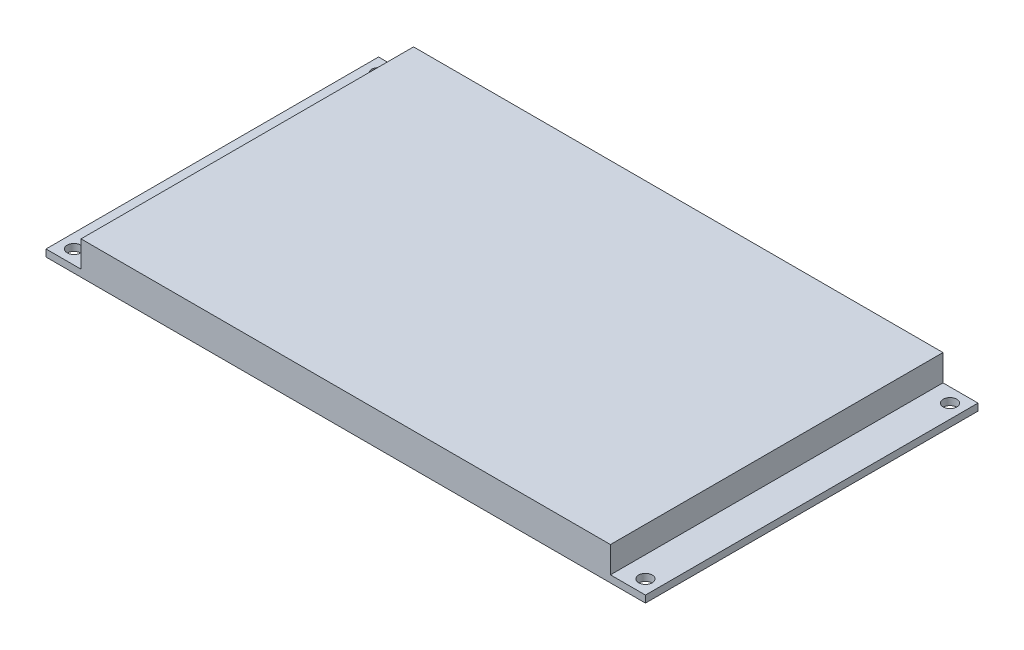
ISO-10303-21;
HEADER;
FILE_DESCRIPTION(('STEP AP214'),'2;1');
FILE_NAME('part.step','',(''),(''),'','','');
FILE_SCHEMA(('AUTOMOTIVE_DESIGN { 1 0 10303 214 1 1 1 1 }'));
ENDSEC;
DATA;
#1=APPLICATION_CONTEXT('core data for automotive mechanical design processes');
#2=APPLICATION_PROTOCOL_DEFINITION('international standard','automotive_design',2000,#1);
#3=PRODUCT_CONTEXT('',#1,'mechanical');
#4=PRODUCT('Part','Part','',(#3));
#5=PRODUCT_RELATED_PRODUCT_CATEGORY('part','',(#4));
#6=PRODUCT_DEFINITION_FORMATION('','',#4);
#7=PRODUCT_DEFINITION_CONTEXT('part definition',#1,'design');
#8=PRODUCT_DEFINITION('design','',#6,#7);
#9=PRODUCT_DEFINITION_SHAPE('','',#8);
#10=(LENGTH_UNIT() NAMED_UNIT(*) SI_UNIT(.MILLI.,.METRE.));
#11=(NAMED_UNIT(*) PLANE_ANGLE_UNIT() SI_UNIT($,.RADIAN.));
#12=(NAMED_UNIT(*) SI_UNIT($,.STERADIAN.) SOLID_ANGLE_UNIT());
#13=UNCERTAINTY_MEASURE_WITH_UNIT(LENGTH_MEASURE(1.E-05),#10,'distance_accuracy_value','');
#14=(GEOMETRIC_REPRESENTATION_CONTEXT(3) GLOBAL_UNCERTAINTY_ASSIGNED_CONTEXT((#13)) GLOBAL_UNIT_ASSIGNED_CONTEXT((#10,
#11,#12)) REPRESENTATION_CONTEXT('',''));
#15=CARTESIAN_POINT('',(0.,0.,0.));
#16=DIRECTION('',(0.,0.,1.));
#17=DIRECTION('',(1.,0.,0.));
#18=AXIS2_PLACEMENT_3D('',#15,#16,#17);
#19=CARTESIAN_POINT('',(0.,1.6,0.));
#20=DIRECTION('',(0.,1.,0.));
#21=DIRECTION('',(0.,0.,1.));
#22=AXIS2_PLACEMENT_3D('',#19,#20,#21);
#23=PLANE('',#22);
#24=CARTESIAN_POINT('',(3.20000000000001,1.6,72.8));
#25=DIRECTION('',(0.,1.,0.));
#26=DIRECTION('',(0.,0.,1.));
#27=AXIS2_PLACEMENT_3D('',#24,#25,#26);
#28=CIRCLE('',#27,1.54999999999999);
#29=CARTESIAN_POINT('',(3.20000000000001,1.6,74.35));
#30=VERTEX_POINT('',#29);
#31=EDGE_CURVE('E187',#30,#30,#28,.T.);
#32=ORIENTED_EDGE('',*,*,#31,.F.);
#33=EDGE_LOOP('',(#32));
#34=FACE_BOUND('',#33,.T.);
#35=CARTESIAN_POINT('',(3.2,1.6,3.2));
#36=DIRECTION('',(0.,1.,0.));
#37=DIRECTION('',(0.,0.,1.));
#38=AXIS2_PLACEMENT_3D('',#35,#36,#37);
#39=CIRCLE('',#38,1.55);
#40=CARTESIAN_POINT('',(3.2,1.6,4.75));
#41=VERTEX_POINT('',#40);
#42=EDGE_CURVE('E162',#41,#41,#39,.T.);
#43=ORIENTED_EDGE('',*,*,#42,.F.);
#44=EDGE_LOOP('',(#43));
#45=FACE_BOUND('',#44,.T.);
#46=DIRECTION('',(0.,0.,1.));
#47=VECTOR('',#46,1.);
#48=CARTESIAN_POINT('',(8.00000000000001,1.6,0.));
#49=LINE('',#48,#47);
#50=CARTESIAN_POINT('',(8.00000000000001,1.6,0.));
#51=VERTEX_POINT('',#50);
#52=CARTESIAN_POINT('',(8.00000000000001,1.6,76.));
#53=VERTEX_POINT('',#52);
#54=EDGE_CURVE('E54',#51,#53,#49,.T.);
#55=ORIENTED_EDGE('',*,*,#54,.F.);
#56=DIRECTION('',(-1.,0.,0.));
#57=VECTOR('',#56,1.);
#58=CARTESIAN_POINT('',(0.,1.6,0.));
#59=LINE('',#58,#57);
#60=CARTESIAN_POINT('',(0.,1.6,0.));
#61=VERTEX_POINT('',#60);
#62=EDGE_CURVE('E143',#51,#61,#59,.T.);
#63=ORIENTED_EDGE('',*,*,#62,.T.);
#64=DIRECTION('',(0.,0.,1.));
#65=VECTOR('',#64,1.);
#66=CARTESIAN_POINT('',(0.,1.6,0.));
#67=LINE('',#66,#65);
#68=CARTESIAN_POINT('',(0.,1.6,76.));
#69=VERTEX_POINT('',#68);
#70=EDGE_CURVE('E134',#61,#69,#67,.T.);
#71=ORIENTED_EDGE('',*,*,#70,.T.);
#72=DIRECTION('',(1.,0.,0.));
#73=VECTOR('',#72,1.);
#74=CARTESIAN_POINT('',(0.,1.6,76.));
#75=LINE('',#74,#73);
#76=EDGE_CURVE('E139',#69,#53,#75,.T.);
#77=ORIENTED_EDGE('',*,*,#76,.T.);
#78=EDGE_LOOP('',(#55,#63,#71,#77));
#79=FACE_BOUND('',#78,.T.);
#80=ADVANCED_FACE('F37',(#34,#45,#79),#23,.T.);
#81=CARTESIAN_POINT('',(0.,1.6,0.));
#82=DIRECTION('',(1.,0.,0.));
#83=DIRECTION('',(0.,0.,-1.));
#84=AXIS2_PLACEMENT_3D('',#81,#82,#83);
#85=PLANE('',#84);
#86=DIRECTION('',(0.,0.,1.));
#87=VECTOR('',#86,1.);
#88=CARTESIAN_POINT('',(0.,0.,0.));
#89=LINE('',#88,#87);
#90=CARTESIAN_POINT('',(0.,0.,0.));
#91=VERTEX_POINT('',#90);
#92=CARTESIAN_POINT('',(0.,0.,76.));
#93=VERTEX_POINT('',#92);
#94=EDGE_CURVE('E125',#91,#93,#89,.T.);
#95=ORIENTED_EDGE('',*,*,#94,.T.);
#96=DIRECTION('',(0.,-1.,0.));
#97=VECTOR('',#96,1.);
#98=CARTESIAN_POINT('',(0.,1.6,76.));
#99=LINE('',#98,#97);
#100=EDGE_CURVE('E11',#69,#93,#99,.T.);
#101=ORIENTED_EDGE('',*,*,#100,.F.);
#102=ORIENTED_EDGE('',*,*,#70,.F.);
#103=DIRECTION('',(0.,-1.,0.));
#104=VECTOR('',#103,1.);
#105=CARTESIAN_POINT('',(0.,1.6,0.));
#106=LINE('',#105,#104);
#107=EDGE_CURVE('E145',#61,#91,#106,.T.);
#108=ORIENTED_EDGE('',*,*,#107,.T.);
#109=EDGE_LOOP('',(#95,#101,#102,#108));
#110=FACE_BOUND('',#109,.T.);
#111=ADVANCED_FACE('F39',(#110),#85,.F.);
#112=CARTESIAN_POINT('',(0.,1.6,76.));
#113=DIRECTION('',(0.,0.,-1.));
#114=DIRECTION('',(-1.,0.,0.));
#115=AXIS2_PLACEMENT_3D('',#112,#113,#114);
#116=PLANE('',#115);
#117=DIRECTION('',(1.,0.,0.));
#118=VECTOR('',#117,1.);
#119=CARTESIAN_POINT('',(0.,0.,76.));
#120=LINE('',#119,#118);
#121=CARTESIAN_POINT('',(137.,0.,76.));
#122=VERTEX_POINT('',#121);
#123=EDGE_CURVE('E128',#93,#122,#120,.T.);
#124=ORIENTED_EDGE('',*,*,#123,.T.);
#125=DIRECTION('',(0.,-1.,0.));
#126=VECTOR('',#125,1.);
#127=CARTESIAN_POINT('',(137.,1.6,76.));
#128=LINE('',#127,#126);
#129=CARTESIAN_POINT('',(137.,1.6,76.));
#130=VERTEX_POINT('',#129);
#131=EDGE_CURVE('E46',#130,#122,#128,.T.);
#132=ORIENTED_EDGE('',*,*,#131,.F.);
#133=CARTESIAN_POINT('',(129.,1.6,76.));
#134=VERTEX_POINT('',#133);
#135=EDGE_CURVE('E137',#134,#130,#75,.T.);
#136=ORIENTED_EDGE('',*,*,#135,.F.);
#137=DIRECTION('',(0.,-1.,0.));
#138=VECTOR('',#137,1.);
#139=CARTESIAN_POINT('',(129.,7.6,76.));
#140=LINE('',#139,#138);
#141=CARTESIAN_POINT('',(129.,7.6,76.));
#142=VERTEX_POINT('',#141);
#143=EDGE_CURVE('E110',#142,#134,#140,.T.);
#144=ORIENTED_EDGE('',*,*,#143,.F.);
#145=DIRECTION('',(1.,0.,0.));
#146=VECTOR('',#145,1.);
#147=CARTESIAN_POINT('',(8.00000000000001,7.6,76.));
#148=LINE('',#147,#146);
#149=CARTESIAN_POINT('',(8.00000000000001,7.6,76.));
#150=VERTEX_POINT('',#149);
#151=EDGE_CURVE('E104',#150,#142,#148,.T.);
#152=ORIENTED_EDGE('',*,*,#151,.F.);
#153=DIRECTION('',(0.,-1.,0.));
#154=VECTOR('',#153,1.);
#155=CARTESIAN_POINT('',(8.00000000000001,7.6,76.));
#156=LINE('',#155,#154);
#157=EDGE_CURVE('E108',#150,#53,#156,.T.);
#158=ORIENTED_EDGE('',*,*,#157,.T.);
#159=ORIENTED_EDGE('',*,*,#76,.F.);
#160=ORIENTED_EDGE('',*,*,#100,.T.);
#161=EDGE_LOOP('',(#124,#132,#136,#144,#152,#158,#159,#160));
#162=FACE_BOUND('',#161,.T.);
#163=ADVANCED_FACE('F106',(#162),#116,.F.);
#164=CARTESIAN_POINT('',(137.,1.6,0.));
#165=DIRECTION('',(-1.,0.,0.));
#166=DIRECTION('',(0.,0.,1.));
#167=AXIS2_PLACEMENT_3D('',#164,#165,#166);
#168=PLANE('',#167);
#169=DIRECTION('',(0.,0.,-1.));
#170=VECTOR('',#169,1.);
#171=CARTESIAN_POINT('',(137.,0.,0.));
#172=LINE('',#171,#170);
#173=CARTESIAN_POINT('',(137.,0.,0.));
#174=VERTEX_POINT('',#173);
#175=EDGE_CURVE('E148',#122,#174,#172,.T.);
#176=ORIENTED_EDGE('',*,*,#175,.T.);
#177=DIRECTION('',(0.,-1.,0.));
#178=VECTOR('',#177,1.);
#179=CARTESIAN_POINT('',(137.,1.6,0.));
#180=LINE('',#179,#178);
#181=CARTESIAN_POINT('',(137.,1.6,0.));
#182=VERTEX_POINT('',#181);
#183=EDGE_CURVE('E153',#182,#174,#180,.T.);
#184=ORIENTED_EDGE('',*,*,#183,.F.);
#185=DIRECTION('',(0.,0.,-1.));
#186=VECTOR('',#185,1.);
#187=CARTESIAN_POINT('',(137.,1.6,0.));
#188=LINE('',#187,#186);
#189=EDGE_CURVE('E141',#130,#182,#188,.T.);
#190=ORIENTED_EDGE('',*,*,#189,.F.);
#191=ORIENTED_EDGE('',*,*,#131,.T.);
#192=EDGE_LOOP('',(#176,#184,#190,#191));
#193=FACE_BOUND('',#192,.T.);
#194=ADVANCED_FACE('F211',(#193),#168,.F.);
#195=CARTESIAN_POINT('',(0.,1.6,0.));
#196=DIRECTION('',(0.,0.,1.));
#197=DIRECTION('',(1.,0.,0.));
#198=AXIS2_PLACEMENT_3D('',#195,#196,#197);
#199=PLANE('',#198);
#200=DIRECTION('',(-1.,0.,0.));
#201=VECTOR('',#200,1.);
#202=CARTESIAN_POINT('',(0.,0.,0.));
#203=LINE('',#202,#201);
#204=EDGE_CURVE('E138',#174,#91,#203,.T.);
#205=ORIENTED_EDGE('',*,*,#204,.T.);
#206=ORIENTED_EDGE('',*,*,#107,.F.);
#207=ORIENTED_EDGE('',*,*,#62,.F.);
#208=DIRECTION('',(0.,-1.,0.));
#209=VECTOR('',#208,1.);
#210=CARTESIAN_POINT('',(8.00000000000001,7.6,0.));
#211=LINE('',#210,#209);
#212=CARTESIAN_POINT('',(8.00000000000001,7.6,0.));
#213=VERTEX_POINT('',#212);
#214=EDGE_CURVE('E176',#213,#51,#211,.T.);
#215=ORIENTED_EDGE('',*,*,#214,.F.);
#216=DIRECTION('',(-1.,0.,0.));
#217=VECTOR('',#216,1.);
#218=CARTESIAN_POINT('',(8.00000000000001,7.6,0.));
#219=LINE('',#218,#217);
#220=CARTESIAN_POINT('',(129.,7.6,0.));
#221=VERTEX_POINT('',#220);
#222=EDGE_CURVE('E119',#221,#213,#219,.T.);
#223=ORIENTED_EDGE('',*,*,#222,.F.);
#224=DIRECTION('',(0.,-1.,0.));
#225=VECTOR('',#224,1.);
#226=CARTESIAN_POINT('',(129.,7.6,0.));
#227=LINE('',#226,#225);
#228=CARTESIAN_POINT('',(129.,1.6,0.));
#229=VERTEX_POINT('',#228);
#230=EDGE_CURVE('E130',#221,#229,#227,.T.);
#231=ORIENTED_EDGE('',*,*,#230,.T.);
#232=EDGE_CURVE('E144',#182,#229,#59,.T.);
#233=ORIENTED_EDGE('',*,*,#232,.F.);
#234=ORIENTED_EDGE('',*,*,#183,.T.);
#235=EDGE_LOOP('',(#205,#206,#207,#215,#223,#231,#233,#234));
#236=FACE_BOUND('',#235,.T.);
#237=ADVANCED_FACE('F181',(#236),#199,.F.);
#238=CARTESIAN_POINT('',(133.8,1.6,3.19999999999998));
#239=DIRECTION('',(0.,1.,0.));
#240=DIRECTION('',(0.,0.,1.));
#241=AXIS2_PLACEMENT_3D('',#238,#239,#240);
#242=CIRCLE('',#241,1.54999999999999);
#243=CARTESIAN_POINT('',(133.8,1.6,4.74999999999998));
#244=VERTEX_POINT('',#243);
#245=EDGE_CURVE('E188',#244,#244,#242,.T.);
#246=ORIENTED_EDGE('',*,*,#245,.F.);
#247=EDGE_LOOP('',(#246));
#248=FACE_BOUND('',#247,.T.);
#249=CARTESIAN_POINT('',(133.8,1.6,72.8));
#250=DIRECTION('',(0.,1.,0.));
#251=DIRECTION('',(0.,0.,1.));
#252=AXIS2_PLACEMENT_3D('',#249,#250,#251);
#253=CIRCLE('',#252,1.54999999999999);
#254=CARTESIAN_POINT('',(133.8,1.6,74.35));
#255=VERTEX_POINT('',#254);
#256=EDGE_CURVE('E191',#255,#255,#253,.T.);
#257=ORIENTED_EDGE('',*,*,#256,.F.);
#258=EDGE_LOOP('',(#257));
#259=FACE_BOUND('',#258,.T.);
#260=DIRECTION('',(0.,0.,-1.));
#261=VECTOR('',#260,1.);
#262=CARTESIAN_POINT('',(129.,1.6,0.));
#263=LINE('',#262,#261);
#264=EDGE_CURVE('E62',#134,#229,#263,.T.);
#265=ORIENTED_EDGE('',*,*,#264,.F.);
#266=ORIENTED_EDGE('',*,*,#135,.T.);
#267=ORIENTED_EDGE('',*,*,#189,.T.);
#268=ORIENTED_EDGE('',*,*,#232,.T.);
#269=EDGE_LOOP('',(#265,#266,#267,#268));
#270=FACE_BOUND('',#269,.T.);
#271=ADVANCED_FACE('F200',(#248,#259,#270),#23,.T.);
#272=CARTESIAN_POINT('',(0.,0.,0.));
#273=DIRECTION('',(0.,1.,0.));
#274=DIRECTION('',(0.,0.,1.));
#275=AXIS2_PLACEMENT_3D('',#272,#273,#274);
#276=PLANE('',#275);
#277=CARTESIAN_POINT('',(3.20000000000001,0.,72.8));
#278=DIRECTION('',(0.,1.,0.));
#279=DIRECTION('',(0.,0.,1.));
#280=AXIS2_PLACEMENT_3D('',#277,#278,#279);
#281=CIRCLE('',#280,1.54999999999999);
#282=CARTESIAN_POINT('',(3.20000000000001,0.,74.35));
#283=VERTEX_POINT('',#282);
#284=EDGE_CURVE('E41',#283,#283,#281,.T.);
#285=ORIENTED_EDGE('',*,*,#284,.T.);
#286=EDGE_LOOP('',(#285));
#287=FACE_BOUND('',#286,.T.);
#288=CARTESIAN_POINT('',(133.8,0.,3.19999999999998));
#289=DIRECTION('',(0.,1.,0.));
#290=DIRECTION('',(0.,0.,1.));
#291=AXIS2_PLACEMENT_3D('',#288,#289,#290);
#292=CIRCLE('',#291,1.54999999999999);
#293=CARTESIAN_POINT('',(133.8,0.,4.74999999999998));
#294=VERTEX_POINT('',#293);
#295=EDGE_CURVE('E164',#294,#294,#292,.T.);
#296=ORIENTED_EDGE('',*,*,#295,.T.);
#297=EDGE_LOOP('',(#296));
#298=FACE_BOUND('',#297,.T.);
#299=CARTESIAN_POINT('',(133.8,0.,72.8));
#300=DIRECTION('',(0.,1.,0.));
#301=DIRECTION('',(0.,0.,1.));
#302=AXIS2_PLACEMENT_3D('',#299,#300,#301);
#303=CIRCLE('',#302,1.54999999999999);
#304=CARTESIAN_POINT('',(133.8,0.,74.35));
#305=VERTEX_POINT('',#304);
#306=EDGE_CURVE('E161',#305,#305,#303,.T.);
#307=ORIENTED_EDGE('',*,*,#306,.T.);
#308=EDGE_LOOP('',(#307));
#309=FACE_BOUND('',#308,.T.);
#310=CARTESIAN_POINT('',(3.2,0.,3.2));
#311=DIRECTION('',(0.,1.,0.));
#312=DIRECTION('',(0.,0.,1.));
#313=AXIS2_PLACEMENT_3D('',#310,#311,#312);
#314=CIRCLE('',#313,1.55);
#315=CARTESIAN_POINT('',(3.2,0.,4.75));
#316=VERTEX_POINT('',#315);
#317=EDGE_CURVE('E158',#316,#316,#314,.T.);
#318=ORIENTED_EDGE('',*,*,#317,.T.);
#319=EDGE_LOOP('',(#318));
#320=FACE_BOUND('',#319,.T.);
#321=ORIENTED_EDGE('',*,*,#94,.F.);
#322=ORIENTED_EDGE('',*,*,#204,.F.);
#323=ORIENTED_EDGE('',*,*,#175,.F.);
#324=ORIENTED_EDGE('',*,*,#123,.F.);
#325=EDGE_LOOP('',(#321,#322,#323,#324));
#326=FACE_BOUND('',#325,.T.);
#327=ADVANCED_FACE('F202',(#287,#298,#309,#320,#326),#276,.F.);
#328=CARTESIAN_POINT('',(8.00000000000001,7.6,0.));
#329=DIRECTION('',(1.,0.,0.));
#330=DIRECTION('',(0.,0.,-1.));
#331=AXIS2_PLACEMENT_3D('',#328,#329,#330);
#332=PLANE('',#331);
#333=ORIENTED_EDGE('',*,*,#54,.T.);
#334=ORIENTED_EDGE('',*,*,#157,.F.);
#335=DIRECTION('',(0.,0.,1.));
#336=VECTOR('',#335,1.);
#337=CARTESIAN_POINT('',(8.00000000000001,7.6,0.));
#338=LINE('',#337,#336);
#339=EDGE_CURVE('E114',#213,#150,#338,.T.);
#340=ORIENTED_EDGE('',*,*,#339,.F.);
#341=ORIENTED_EDGE('',*,*,#214,.T.);
#342=EDGE_LOOP('',(#333,#334,#340,#341));
#343=FACE_BOUND('',#342,.T.);
#344=ADVANCED_FACE('F124',(#343),#332,.F.);
#345=CARTESIAN_POINT('',(129.,7.6,0.));
#346=DIRECTION('',(-1.,0.,0.));
#347=DIRECTION('',(0.,0.,1.));
#348=AXIS2_PLACEMENT_3D('',#345,#346,#347);
#349=PLANE('',#348);
#350=ORIENTED_EDGE('',*,*,#264,.T.);
#351=ORIENTED_EDGE('',*,*,#230,.F.);
#352=DIRECTION('',(0.,0.,-1.));
#353=VECTOR('',#352,1.);
#354=CARTESIAN_POINT('',(129.,7.6,0.));
#355=LINE('',#354,#353);
#356=EDGE_CURVE('E113',#142,#221,#355,.T.);
#357=ORIENTED_EDGE('',*,*,#356,.F.);
#358=ORIENTED_EDGE('',*,*,#143,.T.);
#359=EDGE_LOOP('',(#350,#351,#357,#358));
#360=FACE_BOUND('',#359,.T.);
#361=ADVANCED_FACE('F183',(#360),#349,.F.);
#362=CARTESIAN_POINT('',(0.,7.6,0.));
#363=DIRECTION('',(0.,1.,0.));
#364=DIRECTION('',(0.,0.,1.));
#365=AXIS2_PLACEMENT_3D('',#362,#363,#364);
#366=PLANE('',#365);
#367=ORIENTED_EDGE('',*,*,#339,.T.);
#368=ORIENTED_EDGE('',*,*,#151,.T.);
#369=ORIENTED_EDGE('',*,*,#356,.T.);
#370=ORIENTED_EDGE('',*,*,#222,.T.);
#371=EDGE_LOOP('',(#367,#368,#369,#370));
#372=FACE_BOUND('',#371,.T.);
#373=ADVANCED_FACE('F117',(#372),#366,.T.);
#374=CARTESIAN_POINT('',(3.2,-4.,3.2));
#375=DIRECTION('',(0.,1.,0.));
#376=DIRECTION('',(0.,0.,1.));
#377=AXIS2_PLACEMENT_3D('',#374,#375,#376);
#378=CYLINDRICAL_SURFACE('',#377,1.55);
#379=ORIENTED_EDGE('',*,*,#42,.T.);
#380=EDGE_LOOP('',(#379));
#381=FACE_BOUND('',#380,.T.);
#382=ORIENTED_EDGE('',*,*,#317,.F.);
#383=EDGE_LOOP('',(#382));
#384=FACE_BOUND('',#383,.T.);
#385=ADVANCED_FACE('F225',(#381,#384),#378,.F.);
#386=CARTESIAN_POINT('',(133.8,-4.,72.8));
#387=DIRECTION('',(0.,1.,0.));
#388=DIRECTION('',(0.,0.,1.));
#389=AXIS2_PLACEMENT_3D('',#386,#387,#388);
#390=CYLINDRICAL_SURFACE('',#389,1.54999999999999);
#391=ORIENTED_EDGE('',*,*,#256,.T.);
#392=EDGE_LOOP('',(#391));
#393=FACE_BOUND('',#392,.T.);
#394=ORIENTED_EDGE('',*,*,#306,.F.);
#395=EDGE_LOOP('',(#394));
#396=FACE_BOUND('',#395,.T.);
#397=ADVANCED_FACE('F197',(#393,#396),#390,.F.);
#398=CARTESIAN_POINT('',(133.8,-4.,3.19999999999998));
#399=DIRECTION('',(0.,1.,0.));
#400=DIRECTION('',(0.,0.,1.));
#401=AXIS2_PLACEMENT_3D('',#398,#399,#400);
#402=CYLINDRICAL_SURFACE('',#401,1.54999999999999);
#403=ORIENTED_EDGE('',*,*,#245,.T.);
#404=EDGE_LOOP('',(#403));
#405=FACE_BOUND('',#404,.T.);
#406=ORIENTED_EDGE('',*,*,#295,.F.);
#407=EDGE_LOOP('',(#406));
#408=FACE_BOUND('',#407,.T.);
#409=ADVANCED_FACE('F282',(#405,#408),#402,.F.);
#410=CARTESIAN_POINT('',(3.20000000000001,-4.,72.8));
#411=DIRECTION('',(0.,1.,0.));
#412=DIRECTION('',(0.,0.,1.));
#413=AXIS2_PLACEMENT_3D('',#410,#411,#412);
#414=CYLINDRICAL_SURFACE('',#413,1.54999999999999);
#415=ORIENTED_EDGE('',*,*,#31,.T.);
#416=EDGE_LOOP('',(#415));
#417=FACE_BOUND('',#416,.T.);
#418=ORIENTED_EDGE('',*,*,#284,.F.);
#419=EDGE_LOOP('',(#418));
#420=FACE_BOUND('',#419,.T.);
#421=ADVANCED_FACE('F289',(#417,#420),#414,.F.);
#422=CLOSED_SHELL('',(#80,#111,#163,#194,#237,#271,#327,#344,#361,#373,#385,#397,#409,#421));
#423=MANIFOLD_SOLID_BREP('B2',#422);
#424=ADVANCED_BREP_SHAPE_REPRESENTATION('',(#18,#423),#14);
#425=SHAPE_DEFINITION_REPRESENTATION(#9,#424);
ENDSEC;
END-ISO-10303-21;
